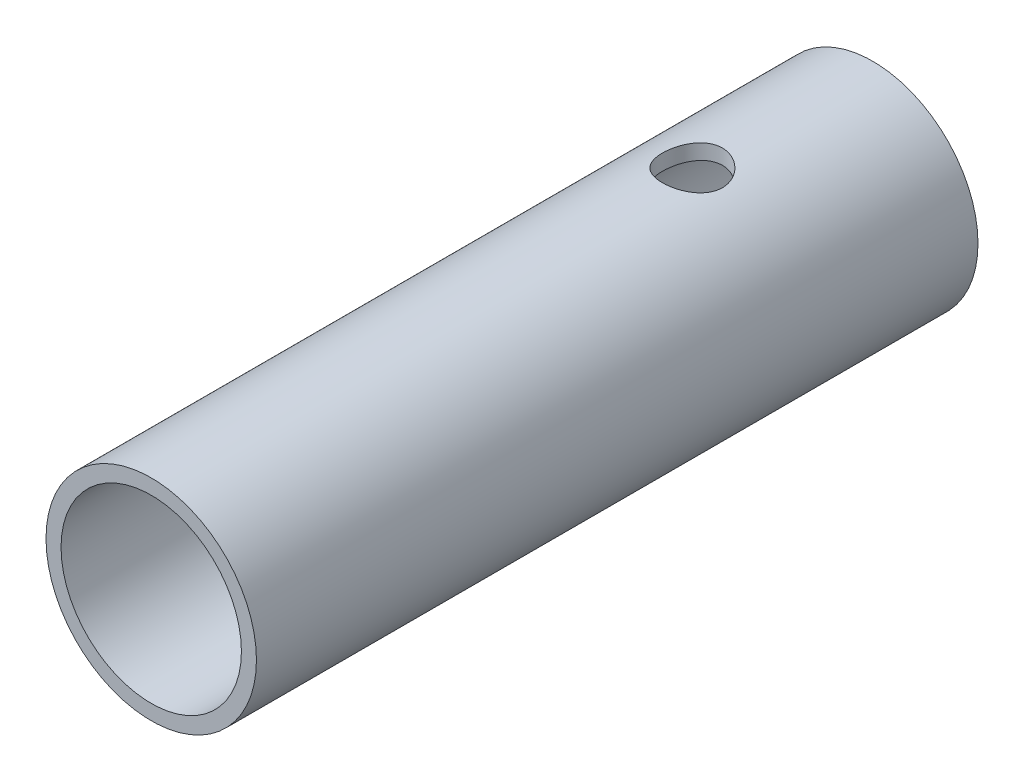
ISO-10303-21;
HEADER;
FILE_DESCRIPTION(('STEP AP214'),'2;1');
FILE_NAME('part.step','',(''),(''),'','','');
FILE_SCHEMA(('AUTOMOTIVE_DESIGN { 1 0 10303 214 1 1 1 1 }'));
ENDSEC;
DATA;
#1=APPLICATION_CONTEXT('core data for automotive mechanical design processes');
#2=APPLICATION_PROTOCOL_DEFINITION('international standard','automotive_design',2000,#1);
#3=PRODUCT_CONTEXT('',#1,'mechanical');
#4=PRODUCT('Part','Part','',(#3));
#5=PRODUCT_RELATED_PRODUCT_CATEGORY('part','',(#4));
#6=PRODUCT_DEFINITION_FORMATION('','',#4);
#7=PRODUCT_DEFINITION_CONTEXT('part definition',#1,'design');
#8=PRODUCT_DEFINITION('design','',#6,#7);
#9=PRODUCT_DEFINITION_SHAPE('','',#8);
#10=(LENGTH_UNIT() NAMED_UNIT(*) SI_UNIT(.MILLI.,.METRE.));
#11=(NAMED_UNIT(*) PLANE_ANGLE_UNIT() SI_UNIT($,.RADIAN.));
#12=(NAMED_UNIT(*) SI_UNIT($,.STERADIAN.) SOLID_ANGLE_UNIT());
#13=UNCERTAINTY_MEASURE_WITH_UNIT(LENGTH_MEASURE(1.E-05),#10,'distance_accuracy_value','');
#14=(GEOMETRIC_REPRESENTATION_CONTEXT(3) GLOBAL_UNCERTAINTY_ASSIGNED_CONTEXT((#13)) GLOBAL_UNIT_ASSIGNED_CONTEXT((#10,
#11,#12)) REPRESENTATION_CONTEXT('',''));
#15=CARTESIAN_POINT('',(0.,0.,0.));
#16=DIRECTION('',(0.,0.,1.));
#17=DIRECTION('',(1.,0.,0.));
#18=AXIS2_PLACEMENT_3D('',#15,#16,#17);
#19=CARTESIAN_POINT('',(0.,0.,152.4));
#20=DIRECTION('',(0.,0.,-1.));
#21=DIRECTION('',(-1.,0.,0.));
#22=AXIS2_PLACEMENT_3D('',#19,#20,#21);
#23=CYLINDRICAL_SURFACE('',#22,22.225);
#24=CARTESIAN_POINT('',(0.,0.,0.));
#25=DIRECTION('',(0.,0.,1.));
#26=DIRECTION('',(1.,0.,0.));
#27=AXIS2_PLACEMENT_3D('',#24,#25,#26);
#28=CIRCLE('',#27,22.225);
#29=CARTESIAN_POINT('',(22.225,0.,0.));
#30=VERTEX_POINT('',#29);
#31=EDGE_CURVE('E42',#30,#30,#28,.T.);
#32=ORIENTED_EDGE('',*,*,#31,.T.);
#33=EDGE_LOOP('',(#32));
#34=FACE_BOUND('',#33,.T.);
#35=CARTESIAN_POINT('',(0.,0.,152.4));
#36=DIRECTION('',(0.,0.,1.));
#37=DIRECTION('',(1.,0.,0.));
#38=AXIS2_PLACEMENT_3D('',#35,#36,#37);
#39=CIRCLE('',#38,22.225);
#40=CARTESIAN_POINT('',(22.225,0.,152.4));
#41=VERTEX_POINT('',#40);
#42=EDGE_CURVE('E10',#41,#41,#39,.T.);
#43=ORIENTED_EDGE('',*,*,#42,.F.);
#44=EDGE_LOOP('',(#43));
#45=FACE_BOUND('',#44,.T.);
#46=CARTESIAN_POINT('',(0.,22.225,31.75));
#47=CARTESIAN_POINT('',(-0.843742976734649,22.225,31.75));
#48=CARTESIAN_POINT('',(-1.67135415991453,22.1755328651492,31.9176817069163));
#49=CARTESIAN_POINT('',(-3.2074073913103,22.0059133054583,32.5568039876774));
#50=CARTESIAN_POINT('',(-3.90897477065735,21.8866172631672,33.0284289853412));
#51=CARTESIAN_POINT('',(-5.65578718506876,21.5261838755787,34.7761112270916));
#52=CARTESIAN_POINT('',(-6.34889956791683,21.2988755710668,36.4295342983248));
#53=CARTESIAN_POINT('',(-6.35109766950525,21.2982202239457,39.7620889796798));
#54=CARTESIAN_POINT('',(-5.66354522402532,21.5246410501816,41.4166660021972));
#55=CARTESIAN_POINT('',(-3.9035483237625,21.8877079303656,43.1767302422651));
#56=CARTESIAN_POINT('',(-3.20362183950376,22.0063798168633,43.6449828355617));
#57=CARTESIAN_POINT('',(-1.67237272717928,22.1753718118994,44.2816823760693));
#58=CARTESIAN_POINT('',(-0.834225029837362,22.2248985471193,44.4496449148879));
#59=CARTESIAN_POINT('',(0.828810531891064,22.2251011231081,44.4503539309078));
#60=CARTESIAN_POINT('',(1.66851772469092,22.1756569384339,44.2826729265575));
#61=CARTESIAN_POINT('',(3.19949601053662,22.0069747427328,43.6473075624986));
#62=CARTESIAN_POINT('',(3.90162324780364,21.8880353940702,43.1780080834789));
#63=CARTESIAN_POINT('',(5.65996696114605,21.5255180778122,41.421534924316));
#64=CARTESIAN_POINT('',(6.34938921975194,21.2987295851595,39.776997076366));
#65=CARTESIAN_POINT('',(6.35060993676068,21.2983656376908,36.4276315928723));
#66=CARTESIAN_POINT('',(5.65661992539672,21.5259325590651,34.7776844829037));
#67=CARTESIAN_POINT('',(3.32872105212345,22.0064249180771,32.4471471332889));
#68=CARTESIAN_POINT('',(1.68748595346929,22.225,31.75));
#69=CARTESIAN_POINT('',(0.,22.225,31.75));
#70=B_SPLINE_CURVE_WITH_KNOTS('',3,(#46,#47,#48,#49,#50,#51,#52,#53,#54,#55,#56,#57,#58,#59,#60,
#61,#62,#63,#64,#65,#66,#67,#68,#69),.UNSPECIFIED.,.T.,.F.,(4,2,2,2,2,2,2,2,2,2,2,4),(0.,
0.0625000000000001,0.125,0.25,0.375,0.4375,0.5,0.5625,0.625,0.75,0.875,1.),.UNSPECIFIED.);
#71=CARTESIAN_POINT('',(0.,22.225,31.75));
#72=VERTEX_POINT('',#71);
#73=EDGE_CURVE('E55',#72,#72,#70,.T.);
#74=ORIENTED_EDGE('',*,*,#73,.F.);
#75=EDGE_LOOP('',(#74));
#76=FACE_BOUND('',#75,.T.);
#77=ADVANCED_FACE('F33',(#34,#45,#76),#23,.T.);
#78=CARTESIAN_POINT('',(0.,0.,152.4));
#79=DIRECTION('',(0.,0.,-1.));
#80=DIRECTION('',(-1.,0.,0.));
#81=AXIS2_PLACEMENT_3D('',#78,#79,#80);
#82=CYLINDRICAL_SURFACE('',#81,19.05);
#83=CARTESIAN_POINT('',(0.,0.,0.));
#84=DIRECTION('',(0.,0.,1.));
#85=DIRECTION('',(1.,0.,0.));
#86=AXIS2_PLACEMENT_3D('',#83,#84,#85);
#87=CIRCLE('',#86,19.05);
#88=CARTESIAN_POINT('',(19.05,0.,0.));
#89=VERTEX_POINT('',#88);
#90=EDGE_CURVE('E50',#89,#89,#87,.T.);
#91=ORIENTED_EDGE('',*,*,#90,.F.);
#92=EDGE_LOOP('',(#91));
#93=FACE_BOUND('',#92,.T.);
#94=CARTESIAN_POINT('',(0.,0.,152.4));
#95=DIRECTION('',(0.,0.,1.));
#96=DIRECTION('',(1.,0.,0.));
#97=AXIS2_PLACEMENT_3D('',#94,#95,#96);
#98=CIRCLE('',#97,19.05);
#99=CARTESIAN_POINT('',(19.05,0.,152.4));
#100=VERTEX_POINT('',#99);
#101=EDGE_CURVE('E47',#100,#100,#98,.T.);
#102=ORIENTED_EDGE('',*,*,#101,.T.);
#103=EDGE_LOOP('',(#102));
#104=FACE_BOUND('',#103,.T.);
#105=CARTESIAN_POINT('',(0.,19.05,31.75));
#106=CARTESIAN_POINT('',(0.0866796333737169,19.0499999901445,31.7500201516742));
#107=CARTESIAN_POINT('',(0.173359579858746,19.0494078749701,31.751845604661));
#108=CARTESIAN_POINT('',(0.346542395581793,19.0470447411972,31.759157217034));
#109=CARTESIAN_POINT('',(0.433045265861697,19.0452737295553,31.7646433548189));
#110=CARTESIAN_POINT('',(0.692044685552298,19.0382081257192,31.7864985318822));
#111=CARTESIAN_POINT('',(0.864071363251715,19.0311609566389,31.8082643741528));
#112=CARTESIAN_POINT('',(1.20560065939011,19.0125830462535,31.8657835073531));
#113=CARTESIAN_POINT('',(1.37510162504248,19.0010494923173,31.9015455729645));
#114=CARTESIAN_POINT('',(1.7103505737583,18.9738104116864,31.9865499714308));
#115=CARTESIAN_POINT('',(1.87609843629639,18.9581047512164,32.0357927365354));
#116=CARTESIAN_POINT('',(2.20229836843888,18.9229812903633,32.1470696265169));
#117=CARTESIAN_POINT('',(2.36276413314314,18.9035741520659,32.209067051061));
#118=CARTESIAN_POINT('',(2.67791819585891,18.8615092141669,32.345415838533));
#119=CARTESIAN_POINT('',(2.83260629063063,18.838851300349,32.4197676355475));
#120=CARTESIAN_POINT('',(3.13521381090783,18.7908593448106,32.5802922462994));
#121=CARTESIAN_POINT('',(3.28313571076896,18.7655262927676,32.6664606919211));
#122=CARTESIAN_POINT('',(3.57136595749967,18.7128115423122,32.8501590583274));
#123=CARTESIAN_POINT('',(3.71167388776333,18.6854297319944,32.9476895998836));
#124=CARTESIAN_POINT('',(3.99018063978921,18.6279924997467,33.1585220697108));
#125=CARTESIAN_POINT('',(4.12796994521966,18.5978719015937,33.2723500014444));
#126=CARTESIAN_POINT('',(4.32679649109121,18.5522496125791,33.4516188481161));
#127=CARTESIAN_POINT('',(4.39176764947795,18.5369672939262,33.5128018765926));
#128=CARTESIAN_POINT('',(4.51895094058095,18.5063734599746,33.6379647035336));
#129=CARTESIAN_POINT('',(4.5811630613315,18.4910619445497,33.7019445141251));
#130=CARTESIAN_POINT('',(4.76354145147673,18.4452404024547,33.8979477179739));
#131=CARTESIAN_POINT('',(4.87943707778453,18.4148463203224,34.0340234614164));
#132=CARTESIAN_POINT('',(5.09927698034502,18.355185849179,34.3156669340194));
#133=CARTESIAN_POINT('',(5.20322004859764,18.3259195743494,34.4612356202701));
#134=CARTESIAN_POINT('',(5.4944865851251,18.2415396229852,34.9075977269515));
#135=CARTESIAN_POINT('',(5.66387078549628,18.1891570376393,35.2208961678544));
#136=CARTESIAN_POINT('',(5.95002146258803,18.0975830592582,35.8725889125697));
#137=CARTESIAN_POINT('',(6.06678664152245,18.0583919915822,36.2109838351174));
#138=CARTESIAN_POINT('',(6.19943553853173,18.0130948481637,36.7324719006922));
#139=CARTESIAN_POINT('',(6.23666531903228,18.0002066657097,36.9097720779468));
#140=CARTESIAN_POINT('',(6.29582342961438,17.9796033081801,37.2672749302969));
#141=CARTESIAN_POINT('',(6.31775303952211,17.971887700432,37.4474773613348));
#142=CARTESIAN_POINT('',(6.33871692230381,17.9644985176553,37.718677199642));
#143=CARTESIAN_POINT('',(6.34371676108641,17.9627327268752,37.8091980356441));
#144=CARTESIAN_POINT('',(6.34967749905156,17.9606265558898,37.9903887725927));
#145=CARTESIAN_POINT('',(6.35063846596245,17.9602861517821,38.081058671014));
#146=CARTESIAN_POINT('',(6.34746457974743,17.961409348909,38.3529747698451));
#147=CARTESIAN_POINT('',(6.33727704864673,17.9650159047074,38.5341804900296));
#148=CARTESIAN_POINT('',(6.3027523653853,17.9771551623276,38.8795856162172));
#149=CARTESIAN_POINT('',(6.2796800196842,17.9852471010589,39.0439312627843));
#150=CARTESIAN_POINT('',(6.22082333459248,18.0056880895087,39.3700240254657));
#151=CARTESIAN_POINT('',(6.18503950614144,18.0180369681185,39.5317712457509));
#152=CARTESIAN_POINT('',(6.05922239189124,18.0609070314438,40.011867106903));
#153=CARTESIAN_POINT('',(5.9507274189157,18.0972501584842,40.3250319717423));
#154=CARTESIAN_POINT('',(5.68235276837449,18.1833434505186,40.9434916130635));
#155=CARTESIAN_POINT('',(5.52039290950745,18.2336203097744,41.2478088067362));
#156=CARTESIAN_POINT('',(5.24329602833252,18.3144627472346,41.6810099467218));
#157=CARTESIAN_POINT('',(5.14521101032053,18.3423217969411,41.8215609229269));
#158=CARTESIAN_POINT('',(4.93809500700019,18.3991661934964,42.0940779559138));
#159=CARTESIAN_POINT('',(4.82906480327438,18.428151459833,42.2260446245832));
#160=CARTESIAN_POINT('',(4.47513072645735,18.5185426429024,42.6196688523303));
#161=CARTESIAN_POINT('',(4.21204305841742,18.5807349785836,42.8653111317071));
#162=CARTESIAN_POINT('',(3.7892700559877,18.669892927348,43.1982041347055));
#163=CARTESIAN_POINT('',(3.64354204709764,18.6989429625331,43.3033019891258));
#164=CARTESIAN_POINT('',(3.34342024378831,18.7549267701586,43.5010588999309));
#165=CARTESIAN_POINT('',(3.18902697102383,18.7818606697581,43.5937187039583));
#166=CARTESIAN_POINT('',(2.87250956322375,18.8328674942193,43.7658353202914));
#167=CARTESIAN_POINT('',(2.7103827646242,18.8569394232516,43.8452875407936));
#168=CARTESIAN_POINT('',(2.46224923261002,18.8903892370467,43.9538901416609));
#169=CARTESIAN_POINT('',(2.37870513868716,18.9010971459512,43.9883314464241));
#170=CARTESIAN_POINT('',(2.21009066812087,18.9215541762934,44.0535696439468));
#171=CARTESIAN_POINT('',(2.12502028208352,18.9313032918276,44.0843665142668));
#172=CARTESIAN_POINT('',(1.86789496086703,18.9589858351451,44.1712535518546));
#173=CARTESIAN_POINT('',(1.69379561694217,18.9753721848609,44.2218970178847));
#174=CARTESIAN_POINT('',(1.34160003840644,19.0035216012615,44.3083705418773));
#175=CARTESIAN_POINT('',(1.16350351352662,19.0152843310305,44.3441995203416));
#176=CARTESIAN_POINT('',(0.811713070205152,19.0334813434416,44.3996004019907));
#177=CARTESIAN_POINT('',(0.63812114405403,19.0401068420452,44.4197557956785));
#178=CARTESIAN_POINT('',(0.28976756812165,19.048592565273,44.4456427875261));
#179=CARTESIAN_POINT('',(0.115006138083064,19.0504536612179,44.4513770230437));
#180=CARTESIAN_POINT('',(-0.234329734005214,19.0493594863463,44.4480496230873));
#181=CARTESIAN_POINT('',(-0.408904201247129,19.0464049768664,44.4389903264376));
#182=CARTESIAN_POINT('',(-0.756592650362253,19.0357643033845,44.4065895308166));
#183=CARTESIAN_POINT('',(-0.929706418522223,19.0280774587638,44.3832459774435));
#184=CARTESIAN_POINT('',(-1.26781716430463,19.0084959744764,44.3235859808598));
#185=CARTESIAN_POINT('',(-1.43289848228565,18.9967407712837,44.2876990796404));
#186=CARTESIAN_POINT('',(-1.75941409494718,18.9692853627891,44.2031288344611));
#187=CARTESIAN_POINT('',(-1.92084886617134,18.9535856762553,44.1544471731956));
#188=CARTESIAN_POINT('',(-2.15943821587866,18.927380835197,44.0719883062734));
#189=CARTESIAN_POINT('',(-2.23839616521749,18.9182003447857,44.042919669368));
#190=CARTESIAN_POINT('',(-2.39498110440369,18.8990155109307,43.9816390193363));
#191=CARTESIAN_POINT('',(-2.47260809357394,18.8890111670679,43.949427004611));
#192=CARTESIAN_POINT('',(-2.70333946904685,18.857850541482,43.8482427775113));
#193=CARTESIAN_POINT('',(-2.85431845519533,18.8355439801204,43.7747139937696));
#194=CARTESIAN_POINT('',(-3.15404927596132,18.7877139545775,43.6137975862475));
#195=CARTESIAN_POINT('',(-3.30260235409453,18.7621147207123,43.5260636951101));
#196=CARTESIAN_POINT('',(-3.59187884079071,18.7088891229653,43.3390378080018));
#197=CARTESIAN_POINT('',(-3.73260170722707,18.6812626190313,43.2397450132153));
#198=CARTESIAN_POINT('',(-4.00533623133857,18.6246928901602,43.0302581643563));
#199=CARTESIAN_POINT('',(-4.1373501145003,18.5957500048289,42.9200669133951));
#200=CARTESIAN_POINT('',(-4.39194998319761,18.5372681844828,42.689438014081));
#201=CARTESIAN_POINT('',(-4.51453685389744,18.5077293057592,42.5690013299813));
#202=CARTESIAN_POINT('',(-4.75400770091301,18.4477048021487,42.3129339595377));
#203=CARTESIAN_POINT('',(-4.87044236091953,18.4172309049598,42.1768796477452));
#204=CARTESIAN_POINT('',(-5.09136745104147,18.3573845963421,41.8951592192325));
#205=CARTESIAN_POINT('',(-5.19585629592912,18.3280123314482,41.7494918308785));
#206=CARTESIAN_POINT('',(-5.39247718867292,18.2711296535511,41.449499405571));
#207=CARTESIAN_POINT('',(-5.48459753820618,18.2436210152077,41.2951663654127));
#208=CARTESIAN_POINT('',(-5.65586871278026,18.1912525499705,40.9790428058636));
#209=CARTESIAN_POINT('',(-5.7350200694999,18.1663926145049,40.8172525925368));
#210=CARTESIAN_POINT('',(-5.87995631646892,18.1200004769129,40.4869624181117));
#211=CARTESIAN_POINT('',(-5.94571619747795,18.0984745187757,40.3184505930624));
#212=CARTESIAN_POINT('',(-6.0631004823156,18.059488946434,39.97609818224));
#213=CARTESIAN_POINT('',(-6.11472424802503,18.0420295158023,39.8022573563038));
#214=CARTESIAN_POINT('',(-6.20313848438267,18.0118226736499,39.4507023055977));
#215=CARTESIAN_POINT('',(-6.23995047202621,17.9990684291863,39.2729940977255));
#216=CARTESIAN_POINT('',(-6.2982070231609,17.978766506013,38.9147910197391));
#217=CARTESIAN_POINT('',(-6.31965365075008,17.9712181279809,38.734296527248));
#218=CARTESIAN_POINT('',(-6.34601980175291,17.961924182497,38.3794812645149));
#219=CARTESIAN_POINT('',(-6.35158819287097,17.9599508234038,38.2052150992409));
#220=CARTESIAN_POINT('',(-6.34762745719949,17.9613509608169,37.8568801861528));
#221=CARTESIAN_POINT('',(-6.33809853944491,17.9647243832925,37.6828114356387));
#222=CARTESIAN_POINT('',(-6.30446263060125,17.9765561596284,37.3361549911242));
#223=CARTESIAN_POINT('',(-6.28034590592972,17.9850179086065,37.1635683641057));
#224=CARTESIAN_POINT('',(-6.21810973280748,18.006628436667,36.8212742699302));
#225=CARTESIAN_POINT('',(-6.17998948710263,18.0197774826073,36.6515669672757));
#226=CARTESIAN_POINT('',(-6.04999374551767,18.064006830804,36.1652791966075));
#227=CARTESIAN_POINT('',(-5.9405924025649,18.1005836205314,35.8537241785384));
#228=CARTESIAN_POINT('',(-5.67708149311365,18.1849459096569,35.2519008433649));
#229=CARTESIAN_POINT('',(-5.52297771665503,18.2327299572924,34.9616297755732));
#230=CARTESIAN_POINT('',(-5.25242487217312,18.3118665260884,34.5339266524387));
#231=CARTESIAN_POINT('',(-5.15044476093562,18.3408823436616,34.3867201498008));
#232=CARTESIAN_POINT('',(-4.93441872577618,18.4001781806945,34.1016413080055));
#233=CARTESIAN_POINT('',(-4.82037372879984,18.4304581029248,33.9637682530918));
#234=CARTESIAN_POINT('',(-4.64062699121234,18.4762253880086,33.7649266661987));
#235=CARTESIAN_POINT('',(-4.5792500388543,18.4915425462427,33.6999603738747));
#236=CARTESIAN_POINT('',(-4.45369222974084,18.5221840153527,33.5727971944395));
#237=CARTESIAN_POINT('',(-4.38951133368837,18.5375083263258,33.5106003461666));
#238=CARTESIAN_POINT('',(-4.19307219579094,18.5832913962226,33.3281388478766));
#239=CARTESIAN_POINT('',(-4.05690519596879,18.6135634596927,33.2119897023215));
#240=CARTESIAN_POINT('',(-3.77564181006314,18.6726432080138,32.9918390527526));
#241=CARTESIAN_POINT('',(-3.6305800533744,18.7014558624713,32.8877945033944));
#242=CARTESIAN_POINT('',(-3.33199665967859,18.7569547487047,32.6920108491046));
#243=CARTESIAN_POINT('',(-3.17847567573161,18.7836411442419,32.6002707961271));
#244=CARTESIAN_POINT('',(-2.86387762734132,18.8341733398657,32.4298631929327));
#245=CARTESIAN_POINT('',(-2.70280027188438,18.8580190304249,32.3511961467188));
#246=CARTESIAN_POINT('',(-2.3741144296112,18.9022105387203,32.2077431619322));
#247=CARTESIAN_POINT('',(-2.20650613254123,18.9225564580441,32.1429568204321));
#248=CARTESIAN_POINT('',(-1.87313424545474,18.958396343163,32.0300854826612));
#249=CARTESIAN_POINT('',(-1.7075865879452,18.9740576204305,31.9814153918869));
#250=CARTESIAN_POINT('',(-1.37275108837107,19.0012174911454,31.8976764539389));
#251=CARTESIAN_POINT('',(-1.20346326160145,19.012716101612,31.8626075511557));
#252=CARTESIAN_POINT('',(-0.862431044554762,19.0312332300396,31.8063996235018));
#253=CARTESIAN_POINT('',(-0.690688254542109,19.0382545415317,31.7852519124839));
#254=CARTESIAN_POINT('',(-0.432165505990343,19.0452929714819,31.764106649241));
#255=CARTESIAN_POINT('',(-0.345831347801398,19.0470568601903,31.7588209458155));
#256=CARTESIAN_POINT('',(-0.172998229691824,19.049410375888,31.7517575767166));
#257=CARTESIAN_POINT('',(-0.0864992707507253,19.050000009835,31.7499798902573));
#258=CARTESIAN_POINT('',(0.,19.05,31.75));
#259=B_SPLINE_CURVE_WITH_KNOTS('',3,(#105,#106,#107,#108,#109,#110,#111,#112,#113,#114,#115,
#116,#117,#118,#119,#120,#121,#122,#123,#124,#125,#126,#127,#128,#129,#130,#131,#132,#133,#134,
#135,#136,#137,#138,#139,#140,#141,#142,#143,#144,#145,#146,#147,#148,#149,#150,#151,#152,#153,
#154,#155,#156,#157,#158,#159,#160,#161,#162,#163,#164,#165,#166,#167,#168,#169,#170,#171,#172,
#173,#174,#175,#176,#177,#178,#179,#180,#181,#182,#183,#184,#185,#186,#187,#188,#189,#190,#191,
#192,#193,#194,#195,#196,#197,#198,#199,#200,#201,#202,#203,#204,#205,#206,#207,#208,#209,#210,
#211,#212,#213,#214,#215,#216,#217,#218,#219,#220,#221,#222,#223,#224,#225,#226,#227,#228,#229,
#230,#231,#232,#233,#234,#235,#236,#237,#238,#239,#240,#241,#242,#243,#244,#245,#246,#247,#248,
#249,#250,#251,#252,#253,#254,#255,#256,#257,#258),.UNSPECIFIED.,.T.,.F.,(4,2,2,2,2,2,2,2,2,2,2,
2,2,2,2,2,2,2,2,2,2,2,2,2,2,2,2,2,2,2,2,2,2,2,2,2,2,2,2,2,2,2,2,2,2,2,2,2,2,2,2,2,2,2,2,2,2,2,2,
2,2,2,2,2,2,2,2,2,2,2,2,2,2,2,2,2,4),(0.,0.260015500456615,0.520029466602864,1.03993984967521,
1.56017670474549,2.08043024282571,2.59920722810605,3.11800244513378,3.63660639986428,
4.15523870197385,4.69826190671643,4.96981988534459,5.2413790415815,5.78454911127305,
6.32777402896153,7.40256908000533,8.4773906381515,9.0216618751174,9.56588757951134,
9.83783023511335,10.1097683304576,10.6534852856011,11.1513807516664,11.6492562070275,
12.6451203837911,13.6855013072603,14.2059316822499,14.7263249203327,15.8158799607399,
16.3614323009953,16.9069518337831,17.452660629297,17.7255723178836,17.9984856867461,
18.5438842795311,19.0893226072711,19.6133282545082,20.1372380640214,20.6610650525835,
21.1849673971183,21.6924490566805,22.1998640084985,22.4537160407059,22.7075682020531,
23.2151955225114,23.7378736487481,24.2605879178187,24.783168091317,25.3056991362585,
25.8499652371154,26.3943034792804,26.9391529921018,27.4839801625971,28.0298156774555,
28.5756758278452,29.1207401219028,29.6657311812823,30.1881077231551,30.7104770323474,
31.2331952728146,31.7559432775014,32.7483337422216,33.740595725868,34.2843077887389,
34.8279781084884,35.0999360553732,35.3718978149497,35.9157657957681,36.4576364376118,
36.9994653049972,37.5413150566441,38.0831490774176,38.6023260062384,39.1215008123402,
39.6403513707741,39.8998273695249,40.1593018308025),.UNSPECIFIED.);
#260=CARTESIAN_POINT('',(0.,19.05,31.75));
#261=VERTEX_POINT('',#260);
#262=EDGE_CURVE('E58',#261,#261,#259,.T.);
#263=ORIENTED_EDGE('',*,*,#262,.F.);
#264=EDGE_LOOP('',(#263));
#265=FACE_BOUND('',#264,.T.);
#266=ADVANCED_FACE('F78',(#93,#104,#265),#82,.F.);
#267=CARTESIAN_POINT('',(0.,0.,152.4));
#268=DIRECTION('',(0.,0.,1.));
#269=DIRECTION('',(1.,0.,0.));
#270=AXIS2_PLACEMENT_3D('',#267,#268,#269);
#271=PLANE('',#270);
#272=ORIENTED_EDGE('',*,*,#42,.T.);
#273=EDGE_LOOP('',(#272));
#274=FACE_BOUND('',#273,.T.);
#275=ORIENTED_EDGE('',*,*,#101,.F.);
#276=EDGE_LOOP('',(#275));
#277=FACE_BOUND('',#276,.T.);
#278=ADVANCED_FACE('F88',(#274,#277),#271,.T.);
#279=CARTESIAN_POINT('',(0.,0.,0.));
#280=DIRECTION('',(0.,0.,1.));
#281=DIRECTION('',(1.,0.,0.));
#282=AXIS2_PLACEMENT_3D('',#279,#280,#281);
#283=PLANE('',#282);
#284=ORIENTED_EDGE('',*,*,#31,.F.);
#285=EDGE_LOOP('',(#284));
#286=FACE_BOUND('',#285,.T.);
#287=ORIENTED_EDGE('',*,*,#90,.T.);
#288=EDGE_LOOP('',(#287));
#289=FACE_BOUND('',#288,.T.);
#290=ADVANCED_FACE('F77',(#286,#289),#283,.F.);
#291=CARTESIAN_POINT('',(0.,22.225,31.75));
#292=CARTESIAN_POINT('',(-0.843742976734649,22.225,31.75));
#293=CARTESIAN_POINT('',(-1.67135415991453,22.1755328651492,31.9176817069163));
#294=CARTESIAN_POINT('',(-3.2074073913103,22.0059133054583,32.5568039876774));
#295=CARTESIAN_POINT('',(-3.90897477065735,21.8866172631672,33.0284289853412));
#296=CARTESIAN_POINT('',(-5.65578718506876,21.5261838755787,34.7761112270916));
#297=CARTESIAN_POINT('',(-6.34889956791683,21.2988755710668,36.4295342983248));
#298=CARTESIAN_POINT('',(-6.35109766950525,21.2982202239457,39.7620889796798));
#299=CARTESIAN_POINT('',(-5.66354522402532,21.5246410501816,41.4166660021972));
#300=CARTESIAN_POINT('',(-3.9035483237625,21.8877079303656,43.1767302422651));
#301=CARTESIAN_POINT('',(-3.20362183950376,22.0063798168633,43.6449828355617));
#302=CARTESIAN_POINT('',(-1.67237272717928,22.1753718118994,44.2816823760693));
#303=CARTESIAN_POINT('',(-0.834225029837362,22.2248985471193,44.4496449148879));
#304=CARTESIAN_POINT('',(0.828810531891064,22.2251011231081,44.4503539309078));
#305=CARTESIAN_POINT('',(1.66851772469092,22.1756569384339,44.2826729265575));
#306=CARTESIAN_POINT('',(3.19949601053662,22.0069747427328,43.6473075624986));
#307=CARTESIAN_POINT('',(3.90162324780364,21.8880353940702,43.1780080834789));
#308=CARTESIAN_POINT('',(5.65996696114605,21.5255180778122,41.421534924316));
#309=CARTESIAN_POINT('',(6.34938921975194,21.2987295851595,39.776997076366));
#310=CARTESIAN_POINT('',(6.35060993676068,21.2983656376908,36.4276315928723));
#311=CARTESIAN_POINT('',(5.65661992539672,21.5259325590651,34.7776844829037));
#312=CARTESIAN_POINT('',(3.32872105212345,22.0064249180771,32.4471471332889));
#313=CARTESIAN_POINT('',(1.68748595346929,22.225,31.75));
#314=CARTESIAN_POINT('',(0.,22.225,31.75));
#315=B_SPLINE_CURVE_WITH_KNOTS('',3,(#291,#292,#293,#294,#295,#296,#297,#298,#299,#300,#301,
#302,#303,#304,#305,#306,#307,#308,#309,#310,#311,#312,#313,#314),.UNSPECIFIED.,.T.,.F.,(4,2,2,
2,2,2,2,2,2,2,2,4),(0.,0.0625000000000001,0.125,0.25,0.375,0.4375,0.5,0.5625,0.625,0.75,0.875,
1.),.UNSPECIFIED.);
#316=DIRECTION('',(0.,-1.,0.));
#317=VECTOR('',#316,1.);
#318=SURFACE_OF_LINEAR_EXTRUSION('',#315,#317);
#319=ORIENTED_EDGE('',*,*,#262,.T.);
#320=EDGE_LOOP('',(#319));
#321=FACE_BOUND('',#320,.T.);
#322=ORIENTED_EDGE('',*,*,#73,.T.);
#323=EDGE_LOOP('',(#322));
#324=FACE_BOUND('',#323,.T.);
#325=ADVANCED_FACE('F71',(#321,#324),#318,.T.);
#326=CLOSED_SHELL('',(#77,#266,#278,#290,#325));
#327=MANIFOLD_SOLID_BREP('B2',#326);
#328=ADVANCED_BREP_SHAPE_REPRESENTATION('',(#18,#327),#14);
#329=SHAPE_DEFINITION_REPRESENTATION(#9,#328);
ENDSEC;
END-ISO-10303-21;
